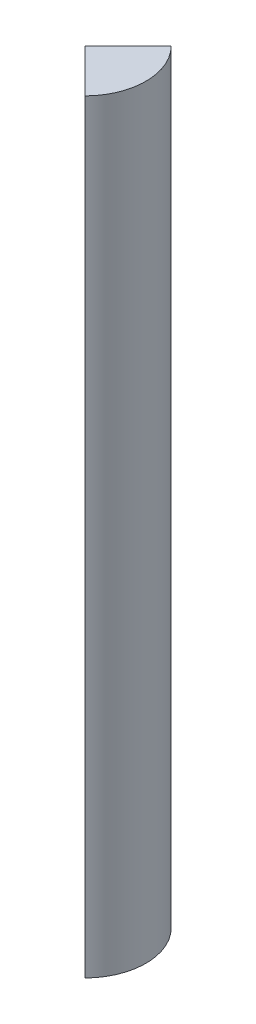
ISO-10303-21;
HEADER;
FILE_DESCRIPTION(('STEP AP214'),'2;1');
FILE_NAME('part.step','',(''),(''),'','','');
FILE_SCHEMA(('AUTOMOTIVE_DESIGN { 1 0 10303 214 1 1 1 1 }'));
ENDSEC;
DATA;
#1=APPLICATION_CONTEXT('core data for automotive mechanical design processes');
#2=APPLICATION_PROTOCOL_DEFINITION('international standard','automotive_design',2000,#1);
#3=PRODUCT_CONTEXT('',#1,'mechanical');
#4=PRODUCT('Part','Part','',(#3));
#5=PRODUCT_RELATED_PRODUCT_CATEGORY('part','',(#4));
#6=PRODUCT_DEFINITION_FORMATION('','',#4);
#7=PRODUCT_DEFINITION_CONTEXT('part definition',#1,'design');
#8=PRODUCT_DEFINITION('design','',#6,#7);
#9=PRODUCT_DEFINITION_SHAPE('','',#8);
#10=(LENGTH_UNIT() NAMED_UNIT(*) SI_UNIT(.MILLI.,.METRE.));
#11=(NAMED_UNIT(*) PLANE_ANGLE_UNIT() SI_UNIT($,.RADIAN.));
#12=(NAMED_UNIT(*) SI_UNIT($,.STERADIAN.) SOLID_ANGLE_UNIT());
#13=UNCERTAINTY_MEASURE_WITH_UNIT(LENGTH_MEASURE(1.E-05),#10,'distance_accuracy_value','');
#14=(GEOMETRIC_REPRESENTATION_CONTEXT(3) GLOBAL_UNCERTAINTY_ASSIGNED_CONTEXT((#13)) GLOBAL_UNIT_ASSIGNED_CONTEXT((#10,
#11,#12)) REPRESENTATION_CONTEXT('',''));
#15=CARTESIAN_POINT('',(0.,0.,0.));
#16=DIRECTION('',(0.,0.,1.));
#17=DIRECTION('',(1.,0.,0.));
#18=AXIS2_PLACEMENT_3D('',#15,#16,#17);
#19=CARTESIAN_POINT('',(0.,-3200.4,0.));
#20=DIRECTION('',(0.,1.,0.));
#21=DIRECTION('',(0.,0.,1.));
#22=AXIS2_PLACEMENT_3D('',#19,#20,#21);
#23=CYLINDRICAL_SURFACE('',#22,1016.);
#24=DIRECTION('',(0.,1.,0.));
#25=VECTOR('',#24,1.);
#26=CARTESIAN_POINT('',(718.420489685532,-3200.4,-718.420489685532));
#27=LINE('',#26,#25);
#28=CARTESIAN_POINT('',(718.420489685532,-3200.4,-718.420489685532));
#29=VERTEX_POINT('',#28);
#30=CARTESIAN_POINT('',(718.420489685532,9499.6,-718.420489685532));
#31=VERTEX_POINT('',#30);
#32=EDGE_CURVE('E93',#29,#31,#27,.T.);
#33=ORIENTED_EDGE('',*,*,#32,.T.);
#34=CARTESIAN_POINT('',(0.,9499.6,0.));
#35=DIRECTION('',(0.,1.,0.));
#36=DIRECTION('',(0.,0.,1.));
#37=AXIS2_PLACEMENT_3D('',#34,#35,#36);
#38=CIRCLE('',#37,1016.);
#39=CARTESIAN_POINT('',(718.420489685533,9499.6,718.420489685532));
#40=VERTEX_POINT('',#39);
#41=EDGE_CURVE('E257',#31,#40,#38,.F.);
#42=ORIENTED_EDGE('',*,*,#41,.T.);
#43=DIRECTION('',(0.,1.,0.));
#44=VECTOR('',#43,1.);
#45=CARTESIAN_POINT('',(718.420489685533,-3200.4,718.420489685532));
#46=LINE('',#45,#44);
#47=CARTESIAN_POINT('',(718.420489685533,-3200.4,718.420489685532));
#48=VERTEX_POINT('',#47);
#49=EDGE_CURVE('E12',#48,#40,#46,.T.);
#50=ORIENTED_EDGE('',*,*,#49,.F.);
#51=CARTESIAN_POINT('',(0.,-3200.4,0.));
#52=DIRECTION('',(0.,1.,0.));
#53=DIRECTION('',(0.,0.,1.));
#54=AXIS2_PLACEMENT_3D('',#51,#52,#53);
#55=CIRCLE('',#54,1016.);
#56=EDGE_CURVE('E114',#29,#48,#55,.F.);
#57=ORIENTED_EDGE('',*,*,#56,.F.);
#58=EDGE_LOOP('',(#33,#42,#50,#57));
#59=FACE_BOUND('',#58,.T.);
#60=ADVANCED_FACE('F90',(#59),#23,.T.);
#61=CARTESIAN_POINT('',(0.,-3200.4,0.));
#62=DIRECTION('',(-0.707106781186547,0.,0.707106781186548));
#63=DIRECTION('',(0.707106781186548,0.,0.707106781186547));
#64=AXIS2_PLACEMENT_3D('',#61,#62,#63);
#65=PLANE('',#64);
#66=DIRECTION('',(-0.707106781186552,0.,-0.707106781186543));
#67=VECTOR('',#66,1.);
#68=CARTESIAN_POINT('',(55.408180266997,1879.6,55.4081802669964));
#69=LINE('',#68,#67);
#70=CARTESIAN_POINT('',(55.408180266997,1879.6,55.4081802669964));
#71=VERTEX_POINT('',#70);
#72=CARTESIAN_POINT('',(0.,1879.6,0.));
#73=VERTEX_POINT('',#72);
#74=EDGE_CURVE('E179',#71,#73,#69,.T.);
#75=ORIENTED_EDGE('',*,*,#74,.F.);
#76=DIRECTION('',(0.,1.,0.));
#77=VECTOR('',#76,1.);
#78=CARTESIAN_POINT('',(55.408180266997,0.,55.4081802669964));
#79=LINE('',#78,#77);
#80=CARTESIAN_POINT('',(55.408180266997,762.,55.4081802669964));
#81=VERTEX_POINT('',#80);
#82=EDGE_CURVE('E205',#81,#71,#79,.T.);
#83=ORIENTED_EDGE('',*,*,#82,.F.);
#84=CARTESIAN_POINT('',(0.,0.,0.));
#85=CARTESIAN_POINT('',(0.00744252285367347,0.00227233781563418,0.00744252285367478));
#86=CARTESIAN_POINT('',(0.0219272873638902,0.0085610149427387,0.0219272873638914));
#87=CARTESIAN_POINT('',(0.0493255944911602,0.0276897047989735,0.049325594491161));
#88=CARTESIAN_POINT('',(0.0882014128426029,0.0612392725084822,0.0882014128426032));
#89=CARTESIAN_POINT('',(0.13134711300565,0.105324785803339,0.13134711300565));
#90=CARTESIAN_POINT('',(0.207000912072369,0.192338612234132,0.207000912072368));
#91=CARTESIAN_POINT('',(0.304651577012048,0.322874783638249,0.304651577012046));
#92=CARTESIAN_POINT('',(0.415111044163018,0.490263052536107,0.415111044163014));
#93=CARTESIAN_POINT('',(0.537316229835537,0.695016600833178,0.537316229835532));
#94=CARTESIAN_POINT('',(0.65854186057101,0.912926923149114,0.658541860571003));
#95=CARTESIAN_POINT('',(0.779217346591338,1.14324051721056,0.77921734659133));
#96=CARTESIAN_POINT('',(0.972095008073755,1.53180499529474,0.972095008073744));
#97=CARTESIAN_POINT('',(1.29726316459696,2.24257055537982,1.29726316459695));
#98=CARTESIAN_POINT('',(1.82404685539025,3.52484966503027,1.82404685539023));
#99=CARTESIAN_POINT('',(2.68540577505891,5.90384692158919,2.68540577505887));
#100=CARTESIAN_POINT('',(4.02605664768997,10.1506153634675,4.02605664768992));
#101=CARTESIAN_POINT('',(6.02703655448762,17.4784804318147,6.02703655448754));
#102=CARTESIAN_POINT('',(8.94231834096983,29.8706347385899,8.94231834096971));
#103=CARTESIAN_POINT('',(12.9533210450602,49.775460189225,12.95332104506));
#104=CARTESIAN_POINT('',(18.0414677307356,79.4252154343225,18.0414677307353));
#105=CARTESIAN_POINT('',(23.5739532457383,117.54325553887,23.573953245738));
#106=CARTESIAN_POINT('',(29.0458549163699,161.899434584109,29.0458549163696));
#107=CARTESIAN_POINT('',(34.0599939274851,209.528749396322,34.0599939274846));
#108=CARTESIAN_POINT('',(38.3776666378904,257.293142225701,38.3776666378899));
#109=CARTESIAN_POINT('',(42.0876302526856,305.158994976242,42.0876302526851));
#110=CARTESIAN_POINT('',(45.2523688549927,353.102640036515,45.2523688549921));
#111=CARTESIAN_POINT('',(47.9181689057436,401.106648045026,47.9181689057429));
#112=CARTESIAN_POINT('',(50.1224638408015,449.157215102931,50.1224638408008));
#113=CARTESIAN_POINT('',(51.8969196541975,497.243146494098,51.8969196541969));
#114=CARTESIAN_POINT('',(53.2713045531254,545.355125755981,53.2713045531247));
#115=CARTESIAN_POINT('',(54.27478842012,593.485273111329,54.2747884201193));
#116=CARTESIAN_POINT('',(54.9407875339309,641.62697798602,54.9407875339302));
#117=CARTESIAN_POINT('',(55.3077420150839,689.774868278503,55.3077420150832));
#118=CARTESIAN_POINT('',(55.4009532184696,725.887462179343,55.4009532184689));
#119=CARTESIAN_POINT('',(55.408180266997,749.962507453051,55.4081802669963));
#120=CARTESIAN_POINT('',(55.408180266997,762.,55.4081802669963));
#121=B_SPLINE_CURVE_WITH_KNOTS('',4,(#84,#85,#86,#87,#88,#89,#90,#91,#92,#93,#94,#95,#96,#97,
#98,#99,#100,#101,#102,#103,#104,#105,#106,#107,#108,#109,#110,#111,#112,#113,#114,#115,#116,
#117,#118,#119,#120),.UNSPECIFIED.,.F.,.F.,(5,1,1,1,1,1,1,1,1,1,1,1,1,1,1,1,1,1,1,1,1,1,1,1,1,1,
1,1,1,1,1,1,1,5),(0.,5.58126706231205E-05,0.000111625341246241,0.000223250682492482,
0.000334876023738723,0.000446501364984964,0.000828139351117325,0.00120977733724969,
0.00152420440145167,0.00183863146565365,0.0022690083501375,0.00269938523462135,
0.00399134570112775,0.00623705373709212,0.00997304543247566,0.0165841038794925,
0.0281521941732146,0.0470471024621586,0.0778272843803244,0.124123811499255,0.18668645852172,
0.249249025429035,0.311811663592453,0.374374313210111,0.436936919731917,0.49949954191604,
0.562062141552318,0.624624763046654,0.687187327400217,0.749749771812347,0.812312452930442,
0.874875110558393,0.937437708701246,1.),.UNSPECIFIED.);
#122=CARTESIAN_POINT('',(0.,0.,0.));
#123=VERTEX_POINT('',#122);
#124=EDGE_CURVE('E213',#123,#81,#121,.T.);
#125=ORIENTED_EDGE('',*,*,#124,.F.);
#126=DIRECTION('',(0.,1.,0.));
#127=VECTOR('',#126,1.);
#128=CARTESIAN_POINT('',(0.,-3200.4,0.));
#129=LINE('',#128,#127);
#130=CARTESIAN_POINT('',(0.,-3200.4,0.));
#131=VERTEX_POINT('',#130);
#132=EDGE_CURVE('E98',#131,#123,#129,.T.);
#133=ORIENTED_EDGE('',*,*,#132,.F.);
#134=DIRECTION('',(0.707106781186548,0.,0.707106781186547));
#135=VECTOR('',#134,1.);
#136=CARTESIAN_POINT('',(0.,-3200.4,0.));
#137=LINE('',#136,#135);
#138=EDGE_CURVE('E261',#131,#48,#137,.T.);
#139=ORIENTED_EDGE('',*,*,#138,.T.);
#140=ORIENTED_EDGE('',*,*,#49,.T.);
#141=DIRECTION('',(0.707106781186548,0.,0.707106781186547));
#142=VECTOR('',#141,1.);
#143=CARTESIAN_POINT('',(0.,9499.6,0.));
#144=LINE('',#143,#142);
#145=CARTESIAN_POINT('',(0.,9499.6,0.));
#146=VERTEX_POINT('',#145);
#147=EDGE_CURVE('E266',#146,#40,#144,.T.);
#148=ORIENTED_EDGE('',*,*,#147,.F.);
#149=EDGE_CURVE('E260',#73,#146,#129,.T.);
#150=ORIENTED_EDGE('',*,*,#149,.F.);
#151=EDGE_LOOP('',(#75,#83,#125,#133,#139,#140,#148,#150));
#152=FACE_BOUND('',#151,.T.);
#153=ADVANCED_FACE('F241',(#152),#65,.T.);
#154=CARTESIAN_POINT('',(0.,-3200.4,0.));
#155=DIRECTION('',(0.707106781186547,0.,0.707106781186547));
#156=DIRECTION('',(0.707106781186548,0.,-0.707106781186548));
#157=AXIS2_PLACEMENT_3D('',#154,#155,#156);
#158=PLANE('',#157);
#159=DIRECTION('',(0.,1.,0.));
#160=VECTOR('',#159,1.);
#161=CARTESIAN_POINT('',(55.4081802669964,0.,-55.408180266997));
#162=LINE('',#161,#160);
#163=CARTESIAN_POINT('',(55.4081802669967,762.,-55.4081802669967));
#164=VERTEX_POINT('',#163);
#165=CARTESIAN_POINT('',(55.4081802669964,1879.6,-55.408180266997));
#166=VERTEX_POINT('',#165);
#167=EDGE_CURVE('E206',#164,#166,#162,.T.);
#168=ORIENTED_EDGE('',*,*,#167,.T.);
#169=DIRECTION('',(0.707106781186543,0.,-0.707106781186552));
#170=VECTOR('',#169,1.);
#171=CARTESIAN_POINT('',(0.,1879.6,0.));
#172=LINE('',#171,#170);
#173=EDGE_CURVE('E203',#73,#166,#172,.T.);
#174=ORIENTED_EDGE('',*,*,#173,.F.);
#175=ORIENTED_EDGE('',*,*,#149,.T.);
#176=DIRECTION('',(0.707106781186548,0.,-0.707106781186548));
#177=VECTOR('',#176,1.);
#178=CARTESIAN_POINT('',(0.,9499.6,0.));
#179=LINE('',#178,#177);
#180=EDGE_CURVE('E264',#146,#31,#179,.T.);
#181=ORIENTED_EDGE('',*,*,#180,.T.);
#182=ORIENTED_EDGE('',*,*,#32,.F.);
#183=DIRECTION('',(0.707106781186548,0.,-0.707106781186548));
#184=VECTOR('',#183,1.);
#185=CARTESIAN_POINT('',(0.,-3200.4,0.));
#186=LINE('',#185,#184);
#187=EDGE_CURVE('E276',#131,#29,#186,.T.);
#188=ORIENTED_EDGE('',*,*,#187,.F.);
#189=ORIENTED_EDGE('',*,*,#132,.T.);
#190=CARTESIAN_POINT('',(0.,0.,0.));
#191=CARTESIAN_POINT('',(0.00744252285367337,0.00227233781563418,-0.00744252285367206));
#192=CARTESIAN_POINT('',(0.02192728736389,0.0085610149427387,-0.0219272873638888));
#193=CARTESIAN_POINT('',(0.0493255944911596,0.0276897047989735,-0.0493255944911588));
#194=CARTESIAN_POINT('',(0.0882014128426018,0.0612392725084822,-0.0882014128426015));
#195=CARTESIAN_POINT('',(0.131347113005648,0.105324785803339,-0.131347113005649));
#196=CARTESIAN_POINT('',(0.207000912072366,0.192338612234132,-0.207000912072368));
#197=CARTESIAN_POINT('',(0.304651577012044,0.322874783638249,-0.304651577012047));
#198=CARTESIAN_POINT('',(0.415111044163013,0.490263052536107,-0.415111044163017));
#199=CARTESIAN_POINT('',(0.53731622983553,0.695016600833178,-0.537316229835536));
#200=CARTESIAN_POINT('',(0.658541860571002,0.912926923149114,-0.658541860571009));
#201=CARTESIAN_POINT('',(0.779217346591328,1.14324051721056,-0.779217346591337));
#202=CARTESIAN_POINT('',(0.972095008073743,1.53180499529474,-0.972095008073754));
#203=CARTESIAN_POINT('',(1.29726316459695,2.24257055537982,-1.29726316459696));
#204=CARTESIAN_POINT('',(1.82404685539022,3.52484966503026,-1.82404685539025));
#205=CARTESIAN_POINT('',(2.68540577505887,5.90384692158919,-2.68540577505891));
#206=CARTESIAN_POINT('',(4.02605664768992,10.1506153634675,-4.02605664768997));
#207=CARTESIAN_POINT('',(6.02703655448754,17.4784804318147,-6.02703655448762));
#208=CARTESIAN_POINT('',(8.94231834096971,29.8706347385899,-8.94231834096983));
#209=CARTESIAN_POINT('',(12.95332104506,49.775460189225,-12.9533210450602));
#210=CARTESIAN_POINT('',(18.0414677307353,79.4252154343225,-18.0414677307356));
#211=CARTESIAN_POINT('',(23.573953245738,117.54325553887,-23.5739532457383));
#212=CARTESIAN_POINT('',(29.0458549163696,161.899434584109,-29.0458549163699));
#213=CARTESIAN_POINT('',(34.0599939274846,209.528749396322,-34.0599939274851));
#214=CARTESIAN_POINT('',(38.3776666378899,257.2931422257,-38.3776666378904));
#215=CARTESIAN_POINT('',(42.0876302526851,305.158994976242,-42.0876302526856));
#216=CARTESIAN_POINT('',(45.2523688549921,353.102640036514,-45.2523688549927));
#217=CARTESIAN_POINT('',(47.9181689057429,401.106648045026,-47.9181689057436));
#218=CARTESIAN_POINT('',(50.1224638408008,449.157215102931,-50.1224638408015));
#219=CARTESIAN_POINT('',(51.8969196541969,497.243146494098,-51.8969196541975));
#220=CARTESIAN_POINT('',(53.2713045531247,545.355125755981,-53.2713045531254));
#221=CARTESIAN_POINT('',(54.2747884201193,593.485273111329,-54.27478842012));
#222=CARTESIAN_POINT('',(54.9407875339302,641.62697798602,-54.9407875339309));
#223=CARTESIAN_POINT('',(55.3077420150832,689.774868278503,-55.3077420150839));
#224=CARTESIAN_POINT('',(55.4009532184689,725.887462179343,-55.4009532184696));
#225=CARTESIAN_POINT('',(55.4081802669963,749.962507453051,-55.408180266997));
#226=CARTESIAN_POINT('',(55.4081802669963,762.,-55.408180266997));
#227=B_SPLINE_CURVE_WITH_KNOTS('',4,(#190,#191,#192,#193,#194,#195,#196,#197,#198,#199,#200,
#201,#202,#203,#204,#205,#206,#207,#208,#209,#210,#211,#212,#213,#214,#215,#216,#217,#218,#219,
#220,#221,#222,#223,#224,#225,#226),.UNSPECIFIED.,.F.,.F.,(5,1,1,1,1,1,1,1,1,1,1,1,1,1,1,1,1,1,
1,1,1,1,1,1,1,1,1,1,1,1,1,1,1,5),(0.,5.58126706231205E-05,0.000111625341246241,
0.000223250682492482,0.000334876023738723,0.000446501364984964,0.000828139351117325,
0.00120977733724969,0.00152420440145167,0.00183863146565365,0.0022690083501375,
0.00269938523462135,0.00399134570112775,0.00623705373709212,0.00997304543247566,
0.0165841038794925,0.0281521941732146,0.0470471024621586,0.0778272843803244,0.124123811499255,
0.18668645852172,0.249249025429035,0.311811663592453,0.374374313210111,0.436936919731917,
0.49949954191604,0.562062141552318,0.624624763046654,0.687187327400217,0.749749771812347,
0.812312452930442,0.874875110558393,0.937437708701246,1.),.UNSPECIFIED.);
#228=EDGE_CURVE('E281',#164,#123,#227,.F.);
#229=ORIENTED_EDGE('',*,*,#228,.F.);
#230=EDGE_LOOP('',(#168,#174,#175,#181,#182,#188,#189,#229));
#231=FACE_BOUND('',#230,.T.);
#232=ADVANCED_FACE('F240',(#231),#158,.F.);
#233=CARTESIAN_POINT('',(0.,-3200.4,0.));
#234=DIRECTION('',(0.,1.,0.));
#235=DIRECTION('',(0.,0.,1.));
#236=AXIS2_PLACEMENT_3D('',#233,#234,#235);
#237=PLANE('',#236);
#238=ORIENTED_EDGE('',*,*,#56,.T.);
#239=ORIENTED_EDGE('',*,*,#138,.F.);
#240=ORIENTED_EDGE('',*,*,#187,.T.);
#241=EDGE_LOOP('',(#238,#239,#240));
#242=FACE_BOUND('',#241,.T.);
#243=ADVANCED_FACE('F236',(#242),#237,.F.);
#244=CARTESIAN_POINT('',(0.,9499.6,0.));
#245=DIRECTION('',(0.,1.,0.));
#246=DIRECTION('',(0.,0.,1.));
#247=AXIS2_PLACEMENT_3D('',#244,#245,#246);
#248=PLANE('',#247);
#249=ORIENTED_EDGE('',*,*,#41,.F.);
#250=ORIENTED_EDGE('',*,*,#180,.F.);
#251=ORIENTED_EDGE('',*,*,#147,.T.);
#252=EDGE_LOOP('',(#249,#250,#251));
#253=FACE_BOUND('',#252,.T.);
#254=ADVANCED_FACE('F233',(#253),#248,.T.);
#255=CARTESIAN_POINT('',(0.,1879.6,0.));
#256=DIRECTION('',(0.,-1.,0.));
#257=DIRECTION('',(0.,0.,-1.));
#258=AXIS2_PLACEMENT_3D('',#255,#256,#257);
#259=CYLINDRICAL_SURFACE('',#258,78.359);
#260=CARTESIAN_POINT('',(0.,1116.33910949619,0.));
#261=DIRECTION('',(0.795473480854899,-0.605988400265707,0.));
#262=DIRECTION('',(-0.605988400265707,-0.795473480854899,0.));
#263=AXIS2_PLACEMENT_3D('',#260,#261,#262);
#264=ELLIPSE('',#263,129.30775566932,78.359);
#265=CARTESIAN_POINT('',(78.3487075898512,1219.18648928045,-1.27));
#266=VERTEX_POINT('',#265);
#267=CARTESIAN_POINT('',(78.3487075898512,1219.18648928045,1.27));
#268=VERTEX_POINT('',#267);
#269=EDGE_CURVE('E175',#266,#268,#264,.T.);
#270=ORIENTED_EDGE('',*,*,#269,.F.);
#271=DIRECTION('',(0.,-1.,0.));
#272=VECTOR('',#271,1.);
#273=CARTESIAN_POINT('',(78.3487075898512,1879.6,-1.27));
#274=LINE('',#273,#272);
#275=CARTESIAN_POINT('',(78.3487075898513,1524.00135609511,-1.27));
#276=VERTEX_POINT('',#275);
#277=EDGE_CURVE('E287',#266,#276,#274,.F.);
#278=ORIENTED_EDGE('',*,*,#277,.T.);
#279=CARTESIAN_POINT('',(0.,1534.32433171841,0.));
#280=DIRECTION('',(-0.130627846246176,-0.99143147306563,0.));
#281=DIRECTION('',(0.99143147306563,-0.130627846246176,0.));
#282=AXIS2_PLACEMENT_3D('',#279,#280,#281);
#283=ELLIPSE('',#282,79.0362240142571,78.359);
#284=CARTESIAN_POINT('',(78.3487075898512,1524.00135609511,1.27));
#285=VERTEX_POINT('',#284);
#286=EDGE_CURVE('E285',#276,#285,#283,.T.);
#287=ORIENTED_EDGE('',*,*,#286,.T.);
#288=DIRECTION('',(0.,-1.,0.));
#289=VECTOR('',#288,1.);
#290=CARTESIAN_POINT('',(78.3487075898512,1879.6,1.27));
#291=LINE('',#290,#289);
#292=EDGE_CURVE('E267',#268,#285,#291,.F.);
#293=ORIENTED_EDGE('',*,*,#292,.F.);
#294=EDGE_LOOP('',(#270,#278,#287,#293));
#295=FACE_BOUND('',#294,.T.);
#296=CARTESIAN_POINT('',(0.,762.,0.));
#297=DIRECTION('',(0.,1.,0.));
#298=DIRECTION('',(0.,0.,1.));
#299=AXIS2_PLACEMENT_3D('',#296,#297,#298);
#300=CIRCLE('',#299,78.359);
#301=EDGE_CURVE('E106',#81,#164,#300,.T.);
#302=ORIENTED_EDGE('',*,*,#301,.F.);
#303=ORIENTED_EDGE('',*,*,#82,.T.);
#304=CARTESIAN_POINT('',(0.,1879.6,0.));
#305=DIRECTION('',(0.,1.,0.));
#306=DIRECTION('',(0.,0.,1.));
#307=AXIS2_PLACEMENT_3D('',#304,#305,#306);
#308=CIRCLE('',#307,78.359);
#309=EDGE_CURVE('E210',#71,#166,#308,.T.);
#310=ORIENTED_EDGE('',*,*,#309,.T.);
#311=ORIENTED_EDGE('',*,*,#167,.F.);
#312=EDGE_LOOP('',(#302,#303,#310,#311));
#313=FACE_BOUND('',#312,.T.);
#314=ADVANCED_FACE('F231',(#295,#313),#259,.F.);
#315=CARTESIAN_POINT('',(0.,1879.6,0.));
#316=DIRECTION('',(0.,1.,0.));
#317=DIRECTION('',(0.,0.,1.));
#318=AXIS2_PLACEMENT_3D('',#315,#316,#317);
#319=PLANE('',#318);
#320=ORIENTED_EDGE('',*,*,#173,.T.);
#321=ORIENTED_EDGE('',*,*,#309,.F.);
#322=ORIENTED_EDGE('',*,*,#74,.T.);
#323=EDGE_LOOP('',(#320,#321,#322));
#324=FACE_BOUND('',#323,.T.);
#325=ADVANCED_FACE('F230',(#324),#319,.F.);
#326=CARTESIAN_POINT('',(0.,0.,0.));
#327=CARTESIAN_POINT('',(0.,0.00227233781563418,0.0105253167579381));
#328=CARTESIAN_POINT('',(0.,0.0085610149427387,0.031009867176067));
#329=CARTESIAN_POINT('',(0.,0.0276897047989735,0.0697569247015154));
#330=CARTESIAN_POINT('',(0.,0.0612392725084822,0.124735634262478));
#331=CARTESIAN_POINT('',(0.,0.105324785803339,0.185752868591142));
#332=CARTESIAN_POINT('',(0.,0.192338612234132,0.292743497276344));
#333=CARTESIAN_POINT('',(0.,0.322874783638249,0.430842392008788));
#334=CARTESIAN_POINT('',(0.,0.490263052536107,0.587055668546195));
#335=CARTESIAN_POINT('',(0.,0.695016600833178,0.759879899516592));
#336=CARTESIAN_POINT('',(0.,0.912926923149114,0.93131883060993));
#337=CARTESIAN_POINT('',(0.,1.14324051721056,1.10197973958584));
#338=CARTESIAN_POINT('',(0.,1.53180499529474,1.37474994433308));
#339=CARTESIAN_POINT('',(0.,2.24257055537982,1.83460716134006));
#340=CARTESIAN_POINT('',(0.,3.52484966503027,2.57959180129687));
#341=CARTESIAN_POINT('',(0.,5.90384692158919,3.79773726756332));
#342=CARTESIAN_POINT('',(0.,10.1506153634675,5.69370391404547));
#343=CARTESIAN_POINT('',(0.,17.4784804318147,8.52351683627475));
#344=CARTESIAN_POINT('',(0.,29.8706347385899,12.6463478768571));
#345=CARTESIAN_POINT('',(0.,49.775460189225,18.3187622996968));
#346=CARTESIAN_POINT('',(0.,79.4252154343225,25.5144883499226));
#347=CARTESIAN_POINT('',(0.,117.54325553887,33.3386043988721));
#348=CARTESIAN_POINT('',(0.,161.899434584109,41.0770419534514));
#349=CARTESIAN_POINT('',(0.,209.528749396322,48.1681053465944));
#350=CARTESIAN_POINT('',(0.,257.293142225701,54.2742166515377));
#351=CARTESIAN_POINT('',(0.,305.158994976242,59.5208975114918));
#352=CARTESIAN_POINT('',(0.,353.102640036515,63.9965137642401));
#353=CARTESIAN_POINT('',(0.,401.106648045026,67.7665243505868));
#354=CARTESIAN_POINT('',(0.,449.157215102931,70.883868143216));
#355=CARTESIAN_POINT('',(0.,497.243146494098,73.3933276203525));
#356=CARTESIAN_POINT('',(0.,545.355125755981,75.3370013843371));
#357=CARTESIAN_POINT('',(0.,593.485273111329,76.7561418786634));
#358=CARTESIAN_POINT('',(0.,641.62697798602,77.6980068579433));
#359=CARTESIAN_POINT('',(0.,689.774868278503,78.2169588619635));
#360=CARTESIAN_POINT('',(0.,725.887462179343,78.3487794099566));
#361=CARTESIAN_POINT('',(0.,749.962507453051,78.359));
#362=CARTESIAN_POINT('',(0.,762.,78.359));
#363=B_SPLINE_CURVE_WITH_KNOTS('',4,(#326,#327,#328,#329,#330,#331,#332,#333,#334,#335,#336,
#337,#338,#339,#340,#341,#342,#343,#344,#345,#346,#347,#348,#349,#350,#351,#352,#353,#354,#355,
#356,#357,#358,#359,#360,#361,#362),.UNSPECIFIED.,.F.,.F.,(5,1,1,1,1,1,1,1,1,1,1,1,1,1,1,1,1,1,
1,1,1,1,1,1,1,1,1,1,1,1,1,1,1,5),(0.,5.58126706231205E-05,0.000111625341246241,
0.000223250682492482,0.000334876023738723,0.000446501364984964,0.000828139351117325,
0.00120977733724969,0.00152420440145167,0.00183863146565365,0.0022690083501375,
0.00269938523462135,0.00399134570112775,0.00623705373709212,0.00997304543247566,
0.0165841038794925,0.0281521941732146,0.0470471024621586,0.0778272843803244,0.124123811499255,
0.18668645852172,0.249249025429035,0.311811663592453,0.374374313210111,0.436936919731917,
0.49949954191604,0.562062141552318,0.624624763046654,0.687187327400217,0.749749771812347,
0.812312452930442,0.874875110558393,0.937437708701246,1.),.UNSPECIFIED.);
#364=CARTESIAN_POINT('',(0.,0.,0.));
#365=DIRECTION('',(0.,-1.,0.));
#366=AXIS1_PLACEMENT('',#364,#365);
#367=SURFACE_OF_REVOLUTION('',#363,#366);
#368=ORIENTED_EDGE('',*,*,#228,.T.);
#369=ORIENTED_EDGE('',*,*,#124,.T.);
#370=ORIENTED_EDGE('',*,*,#301,.T.);
#371=EDGE_LOOP('',(#368,#369,#370));
#372=FACE_BOUND('',#371,.T.);
#373=ADVANCED_FACE('F226',(#372),#367,.T.);
#374=CARTESIAN_POINT('',(0.,0.,1.27));
#375=DIRECTION('',(0.,0.,1.));
#376=DIRECTION('',(1.,0.,0.));
#377=AXIS2_PLACEMENT_3D('',#374,#375,#376);
#378=PLANE('',#377);
#379=ORIENTED_EDGE('',*,*,#292,.T.);
#380=DIRECTION('',(-0.99143147306563,0.130627846246176,0.));
#381=VECTOR('',#380,1.);
#382=CARTESIAN_POINT('',(198.708131746955,1508.14318255493,1.27));
#383=LINE('',#382,#381);
#384=CARTESIAN_POINT('',(261.239,1499.90431495216,1.27));
#385=VERTEX_POINT('',#384);
#386=EDGE_CURVE('E193',#385,#285,#383,.T.);
#387=ORIENTED_EDGE('',*,*,#386,.F.);
#388=DIRECTION('',(0.,-1.,0.));
#389=VECTOR('',#388,1.);
#390=CARTESIAN_POINT('',(261.239,1499.90431495216,1.27));
#391=LINE('',#390,#389);
#392=CARTESIAN_POINT('',(261.239,1459.26431495216,1.27));
#393=VERTEX_POINT('',#392);
#394=EDGE_CURVE('E186',#385,#393,#391,.T.);
#395=ORIENTED_EDGE('',*,*,#394,.T.);
#396=DIRECTION('',(-0.605988400265707,-0.795473480854899,0.));
#397=VECTOR('',#396,1.);
#398=CARTESIAN_POINT('',(-538.128702516037,409.944214889845,1.27));
#399=LINE('',#398,#397);
#400=EDGE_CURVE('E168',#393,#268,#399,.T.);
#401=ORIENTED_EDGE('',*,*,#400,.T.);
#402=EDGE_LOOP('',(#379,#387,#395,#401));
#403=FACE_BOUND('',#402,.T.);
#404=ADVANCED_FACE('F191',(#403),#378,.F.);
#405=CARTESIAN_POINT('',(0.,0.,-1.27));
#406=DIRECTION('',(0.,0.,1.));
#407=DIRECTION('',(1.,0.,0.));
#408=AXIS2_PLACEMENT_3D('',#405,#406,#407);
#409=PLANE('',#408);
#410=DIRECTION('',(-0.605988400265707,-0.795473480854899,0.));
#411=VECTOR('',#410,1.);
#412=CARTESIAN_POINT('',(-538.128702516037,409.944214889845,-1.27));
#413=LINE('',#412,#411);
#414=CARTESIAN_POINT('',(261.239,1459.26431495216,-1.27));
#415=VERTEX_POINT('',#414);
#416=EDGE_CURVE('E180',#415,#266,#413,.T.);
#417=ORIENTED_EDGE('',*,*,#416,.F.);
#418=DIRECTION('',(0.,-1.,0.));
#419=VECTOR('',#418,1.);
#420=CARTESIAN_POINT('',(261.239,1499.90431495216,-1.27));
#421=LINE('',#420,#419);
#422=CARTESIAN_POINT('',(261.239,1499.90431495216,-1.27));
#423=VERTEX_POINT('',#422);
#424=EDGE_CURVE('E188',#423,#415,#421,.T.);
#425=ORIENTED_EDGE('',*,*,#424,.F.);
#426=DIRECTION('',(-0.99143147306563,0.130627846246176,0.));
#427=VECTOR('',#426,1.);
#428=CARTESIAN_POINT('',(198.708131746955,1508.14318255493,-1.27));
#429=LINE('',#428,#427);
#430=EDGE_CURVE('E198',#423,#276,#429,.T.);
#431=ORIENTED_EDGE('',*,*,#430,.T.);
#432=ORIENTED_EDGE('',*,*,#277,.F.);
#433=EDGE_LOOP('',(#417,#425,#431,#432));
#434=FACE_BOUND('',#433,.T.);
#435=ADVANCED_FACE('F304',(#434),#409,.T.);
#436=CARTESIAN_POINT('',(-538.128702516037,409.944214889845,1.27));
#437=DIRECTION('',(0.795473480854899,-0.605988400265707,0.));
#438=DIRECTION('',(0.605988400265707,0.795473480854899,0.));
#439=AXIS2_PLACEMENT_3D('',#436,#437,#438);
#440=PLANE('',#439);
#441=ORIENTED_EDGE('',*,*,#269,.T.);
#442=ORIENTED_EDGE('',*,*,#400,.F.);
#443=DIRECTION('',(0.,0.,-1.));
#444=VECTOR('',#443,1.);
#445=CARTESIAN_POINT('',(261.239,1459.26431495216,1.27));
#446=LINE('',#445,#444);
#447=EDGE_CURVE('E172',#393,#415,#446,.T.);
#448=ORIENTED_EDGE('',*,*,#447,.T.);
#449=ORIENTED_EDGE('',*,*,#416,.T.);
#450=EDGE_LOOP('',(#441,#442,#448,#449));
#451=FACE_BOUND('',#450,.T.);
#452=ADVANCED_FACE('F170',(#451),#440,.F.);
#453=CARTESIAN_POINT('',(198.708131746955,1508.14318255493,1.27));
#454=DIRECTION('',(-0.130627846246176,-0.99143147306563,0.));
#455=DIRECTION('',(0.99143147306563,-0.130627846246176,0.));
#456=AXIS2_PLACEMENT_3D('',#453,#454,#455);
#457=PLANE('',#456);
#458=ORIENTED_EDGE('',*,*,#430,.F.);
#459=DIRECTION('',(0.,0.,-1.));
#460=VECTOR('',#459,1.);
#461=CARTESIAN_POINT('',(261.239,1499.90431495216,1.27));
#462=LINE('',#461,#460);
#463=EDGE_CURVE('E189',#385,#423,#462,.T.);
#464=ORIENTED_EDGE('',*,*,#463,.F.);
#465=ORIENTED_EDGE('',*,*,#386,.T.);
#466=ORIENTED_EDGE('',*,*,#286,.F.);
#467=EDGE_LOOP('',(#458,#464,#465,#466));
#468=FACE_BOUND('',#467,.T.);
#469=ADVANCED_FACE('F301',(#468),#457,.T.);
#470=CARTESIAN_POINT('',(261.239,1499.90431495216,1.27));
#471=DIRECTION('',(1.,0.,0.));
#472=DIRECTION('',(0.,0.,-1.));
#473=AXIS2_PLACEMENT_3D('',#470,#471,#472);
#474=PLANE('',#473);
#475=ORIENTED_EDGE('',*,*,#424,.T.);
#476=ORIENTED_EDGE('',*,*,#447,.F.);
#477=ORIENTED_EDGE('',*,*,#394,.F.);
#478=ORIENTED_EDGE('',*,*,#463,.T.);
#479=EDGE_LOOP('',(#475,#476,#477,#478));
#480=FACE_BOUND('',#479,.T.);
#481=ADVANCED_FACE('F184',(#480),#474,.F.);
#482=CLOSED_SHELL('',(#60,#153,#232,#243,#254,#314,#325,#373,#404,#435,#452,#469,#481));
#483=MANIFOLD_SOLID_BREP('B2',#482);
#484=ADVANCED_BREP_SHAPE_REPRESENTATION('',(#18,#483),#14);
#485=SHAPE_DEFINITION_REPRESENTATION(#9,#484);
ENDSEC;
END-ISO-10303-21;
